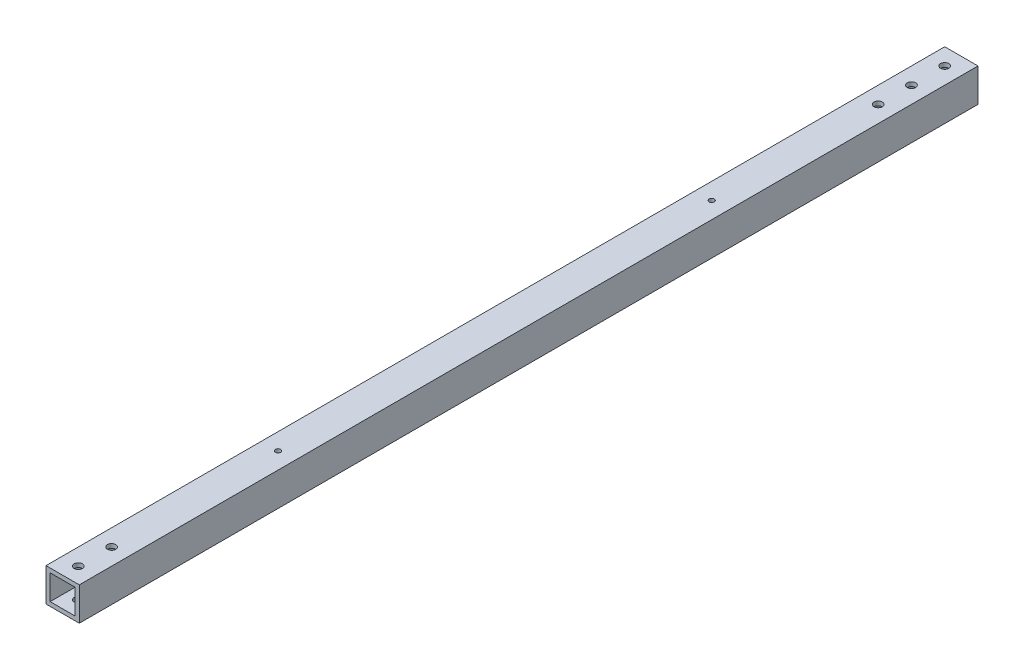
ISO-10303-21;
HEADER;
FILE_DESCRIPTION(('STEP AP214'),'2;1');
FILE_NAME('part.step','',(''),(''),'','','');
FILE_SCHEMA(('AUTOMOTIVE_DESIGN { 1 0 10303 214 1 1 1 1 }'));
ENDSEC;
DATA;
#1=APPLICATION_CONTEXT('core data for automotive mechanical design processes');
#2=APPLICATION_PROTOCOL_DEFINITION('international standard','automotive_design',2000,#1);
#3=PRODUCT_CONTEXT('',#1,'mechanical');
#4=PRODUCT('Part','Part','',(#3));
#5=PRODUCT_RELATED_PRODUCT_CATEGORY('part','',(#4));
#6=PRODUCT_DEFINITION_FORMATION('','',#4);
#7=PRODUCT_DEFINITION_CONTEXT('part definition',#1,'design');
#8=PRODUCT_DEFINITION('design','',#6,#7);
#9=PRODUCT_DEFINITION_SHAPE('','',#8);
#10=(LENGTH_UNIT() NAMED_UNIT(*) SI_UNIT(.MILLI.,.METRE.));
#11=(NAMED_UNIT(*) PLANE_ANGLE_UNIT() SI_UNIT($,.RADIAN.));
#12=(NAMED_UNIT(*) SI_UNIT($,.STERADIAN.) SOLID_ANGLE_UNIT());
#13=UNCERTAINTY_MEASURE_WITH_UNIT(LENGTH_MEASURE(1.E-05),#10,'distance_accuracy_value','');
#14=(GEOMETRIC_REPRESENTATION_CONTEXT(3) GLOBAL_UNCERTAINTY_ASSIGNED_CONTEXT((#13)) GLOBAL_UNIT_ASSIGNED_CONTEXT((#10,
#11,#12)) REPRESENTATION_CONTEXT('',''));
#15=CARTESIAN_POINT('',(0.,0.,0.));
#16=DIRECTION('',(0.,0.,1.));
#17=DIRECTION('',(1.,0.,0.));
#18=AXIS2_PLACEMENT_3D('',#15,#16,#17);
#19=CARTESIAN_POINT('',(12.7,12.7,342.9));
#20=DIRECTION('',(0.,-1.,0.));
#21=DIRECTION('',(1.,0.,0.));
#22=AXIS2_PLACEMENT_3D('',#19,#20,#21);
#23=PLANE('',#22);
#24=CARTESIAN_POINT('',(0.,12.7,305.511799987541));
#25=DIRECTION('',(0.,1.,0.));
#26=DIRECTION('',(0.,0.,1.));
#27=AXIS2_PLACEMENT_3D('',#24,#25,#26);
#28=CIRCLE('',#27,3.17499999999999);
#29=CARTESIAN_POINT('',(0.,12.7,308.686799987541));
#30=VERTEX_POINT('',#29);
#31=EDGE_CURVE('E196',#30,#30,#28,.T.);
#32=ORIENTED_EDGE('',*,*,#31,.F.);
#33=EDGE_LOOP('',(#32));
#34=FACE_BOUND('',#33,.T.);
#35=CARTESIAN_POINT('',(-3.7175124090183E-12,12.7,-330.199999999998));
#36=DIRECTION('',(0.,1.,0.));
#37=DIRECTION('',(0.,0.,1.));
#38=AXIS2_PLACEMENT_3D('',#35,#36,#37);
#39=CIRCLE('',#38,3.17499999999999);
#40=CARTESIAN_POINT('',(-3.7175124090183E-12,12.7,-327.024999999998));
#41=VERTEX_POINT('',#40);
#42=EDGE_CURVE('E193',#41,#41,#39,.T.);
#43=ORIENTED_EDGE('',*,*,#42,.F.);
#44=EDGE_LOOP('',(#43));
#45=FACE_BOUND('',#44,.T.);
#46=CARTESIAN_POINT('',(0.,12.7,-304.799999999998));
#47=DIRECTION('',(0.,1.,0.));
#48=DIRECTION('',(0.,0.,1.));
#49=AXIS2_PLACEMENT_3D('',#46,#47,#48);
#50=CIRCLE('',#49,3.17499999999999);
#51=CARTESIAN_POINT('',(0.,12.7,-301.624999999998));
#52=VERTEX_POINT('',#51);
#53=EDGE_CURVE('E211',#52,#52,#50,.T.);
#54=ORIENTED_EDGE('',*,*,#53,.F.);
#55=EDGE_LOOP('',(#54));
#56=FACE_BOUND('',#55,.T.);
#57=CARTESIAN_POINT('',(-2.38524477946811E-12,12.7,-279.399999999999));
#58=DIRECTION('',(0.,1.,0.));
#59=DIRECTION('',(0.,0.,1.));
#60=AXIS2_PLACEMENT_3D('',#57,#58,#59);
#61=CIRCLE('',#60,3.17499999999999);
#62=CARTESIAN_POINT('',(-2.38524477946811E-12,12.7,-276.224999999999));
#63=VERTEX_POINT('',#62);
#64=EDGE_CURVE('E218',#63,#63,#61,.T.);
#65=ORIENTED_EDGE('',*,*,#64,.F.);
#66=EDGE_LOOP('',(#65));
#67=FACE_BOUND('',#66,.T.);
#68=CARTESIAN_POINT('',(0.,12.7,-152.4));
#69=DIRECTION('',(0.,1.,0.));
#70=DIRECTION('',(0.,0.,1.));
#71=AXIS2_PLACEMENT_3D('',#68,#69,#70);
#72=CIRCLE('',#71,1.98437499999999);
#73=CARTESIAN_POINT('',(0.,12.7,-150.415625));
#74=VERTEX_POINT('',#73);
#75=EDGE_CURVE('E225',#74,#74,#72,.T.);
#76=ORIENTED_EDGE('',*,*,#75,.F.);
#77=EDGE_LOOP('',(#76));
#78=FACE_BOUND('',#77,.T.);
#79=CARTESIAN_POINT('',(0.,12.7,178.5118096));
#80=DIRECTION('',(0.,1.,0.));
#81=DIRECTION('',(0.,0.,1.));
#82=AXIS2_PLACEMENT_3D('',#79,#80,#81);
#83=CIRCLE('',#82,1.98437499999999);
#84=CARTESIAN_POINT('',(0.,12.7,180.4961846));
#85=VERTEX_POINT('',#84);
#86=EDGE_CURVE('E237',#85,#85,#83,.T.);
#87=ORIENTED_EDGE('',*,*,#86,.F.);
#88=EDGE_LOOP('',(#87));
#89=FACE_BOUND('',#88,.T.);
#90=DIRECTION('',(0.,0.,-1.));
#91=VECTOR('',#90,1.);
#92=CARTESIAN_POINT('',(12.7,12.7,342.9));
#93=LINE('',#92,#91);
#94=CARTESIAN_POINT('',(12.7,12.7,342.9));
#95=VERTEX_POINT('',#94);
#96=CARTESIAN_POINT('',(12.7,12.7,-342.9));
#97=VERTEX_POINT('',#96);
#98=EDGE_CURVE('E169',#95,#97,#93,.T.);
#99=ORIENTED_EDGE('',*,*,#98,.T.);
#100=DIRECTION('',(-1.,0.,0.));
#101=VECTOR('',#100,1.);
#102=CARTESIAN_POINT('',(12.7,12.7,-342.9));
#103=LINE('',#102,#101);
#104=CARTESIAN_POINT('',(-12.7,12.7,-342.9));
#105=VERTEX_POINT('',#104);
#106=EDGE_CURVE('E147',#97,#105,#103,.T.);
#107=ORIENTED_EDGE('',*,*,#106,.T.);
#108=DIRECTION('',(0.,0.,-1.));
#109=VECTOR('',#108,1.);
#110=CARTESIAN_POINT('',(-12.7,12.7,342.9));
#111=LINE('',#110,#109);
#112=CARTESIAN_POINT('',(-12.7,12.7,342.9));
#113=VERTEX_POINT('',#112);
#114=EDGE_CURVE('E167',#113,#105,#111,.T.);
#115=ORIENTED_EDGE('',*,*,#114,.F.);
#116=DIRECTION('',(-1.,0.,0.));
#117=VECTOR('',#116,1.);
#118=CARTESIAN_POINT('',(12.7,12.7,342.9));
#119=LINE('',#118,#117);
#120=EDGE_CURVE('E61',#95,#113,#119,.T.);
#121=ORIENTED_EDGE('',*,*,#120,.F.);
#122=EDGE_LOOP('',(#99,#107,#115,#121));
#123=FACE_BOUND('',#122,.T.);
#124=CARTESIAN_POINT('',(7.23379689482329E-13,12.7,330.911799987541));
#125=DIRECTION('',(0.,1.,0.));
#126=DIRECTION('',(0.,0.,1.));
#127=AXIS2_PLACEMENT_3D('',#124,#125,#126);
#128=CIRCLE('',#127,3.17499999999999);
#129=CARTESIAN_POINT('',(7.23379689482329E-13,12.7,334.086799987541));
#130=VERTEX_POINT('',#129);
#131=EDGE_CURVE('E316',#130,#130,#128,.T.);
#132=ORIENTED_EDGE('',*,*,#131,.F.);
#133=EDGE_LOOP('',(#132));
#134=FACE_BOUND('',#133,.T.);
#135=ADVANCED_FACE('F36',(#34,#45,#56,#67,#78,#89,#123,#134),#23,.F.);
#136=CARTESIAN_POINT('',(0.,0.,342.9));
#137=DIRECTION('',(0.,0.,1.));
#138=DIRECTION('',(1.,0.,0.));
#139=AXIS2_PLACEMENT_3D('',#136,#137,#138);
#140=PLANE('',#139);
#141=DIRECTION('',(0.,-1.,0.));
#142=VECTOR('',#141,1.);
#143=CARTESIAN_POINT('',(-12.7,12.7,342.9));
#144=LINE('',#143,#142);
#145=CARTESIAN_POINT('',(-12.7,-12.7,342.9));
#146=VERTEX_POINT('',#145);
#147=EDGE_CURVE('E114',#113,#146,#144,.T.);
#148=ORIENTED_EDGE('',*,*,#147,.T.);
#149=DIRECTION('',(1.,0.,0.));
#150=VECTOR('',#149,1.);
#151=CARTESIAN_POINT('',(-12.7,-12.7,342.9));
#152=LINE('',#151,#150);
#153=CARTESIAN_POINT('',(12.7,-12.7,342.9));
#154=VERTEX_POINT('',#153);
#155=EDGE_CURVE('E162',#146,#154,#152,.T.);
#156=ORIENTED_EDGE('',*,*,#155,.T.);
#157=DIRECTION('',(0.,1.,0.));
#158=VECTOR('',#157,1.);
#159=CARTESIAN_POINT('',(12.7,-12.7,342.9));
#160=LINE('',#159,#158);
#161=EDGE_CURVE('E164',#154,#95,#160,.T.);
#162=ORIENTED_EDGE('',*,*,#161,.T.);
#163=ORIENTED_EDGE('',*,*,#120,.T.);
#164=EDGE_LOOP('',(#148,#156,#162,#163));
#165=FACE_BOUND('',#164,.T.);
#166=DIRECTION('',(1.,0.,0.));
#167=VECTOR('',#166,1.);
#168=CARTESIAN_POINT('',(-9.525,-9.525,342.9));
#169=LINE('',#168,#167);
#170=CARTESIAN_POINT('',(-9.525,-9.525,342.9));
#171=VERTEX_POINT('',#170);
#172=CARTESIAN_POINT('',(9.52500000000001,-9.525,342.9));
#173=VERTEX_POINT('',#172);
#174=EDGE_CURVE('E151',#171,#173,#169,.T.);
#175=ORIENTED_EDGE('',*,*,#174,.F.);
#176=DIRECTION('',(0.,-1.,0.));
#177=VECTOR('',#176,1.);
#178=CARTESIAN_POINT('',(-9.52500000000001,9.525,342.9));
#179=LINE('',#178,#177);
#180=CARTESIAN_POINT('',(-9.52500000000001,9.525,342.9));
#181=VERTEX_POINT('',#180);
#182=EDGE_CURVE('E111',#181,#171,#179,.T.);
#183=ORIENTED_EDGE('',*,*,#182,.F.);
#184=DIRECTION('',(-1.,0.,0.));
#185=VECTOR('',#184,1.);
#186=CARTESIAN_POINT('',(9.525,9.525,342.9));
#187=LINE('',#186,#185);
#188=CARTESIAN_POINT('',(9.525,9.525,342.9));
#189=VERTEX_POINT('',#188);
#190=EDGE_CURVE('E155',#189,#181,#187,.T.);
#191=ORIENTED_EDGE('',*,*,#190,.F.);
#192=DIRECTION('',(0.,1.,0.));
#193=VECTOR('',#192,1.);
#194=CARTESIAN_POINT('',(9.52500000000001,-9.525,342.9));
#195=LINE('',#194,#193);
#196=EDGE_CURVE('E153',#173,#189,#195,.T.);
#197=ORIENTED_EDGE('',*,*,#196,.F.);
#198=EDGE_LOOP('',(#175,#183,#191,#197));
#199=FACE_BOUND('',#198,.T.);
#200=ADVANCED_FACE('F255',(#165,#199),#140,.T.);
#201=CARTESIAN_POINT('',(-12.7,12.7,342.9));
#202=DIRECTION('',(1.,0.,0.));
#203=DIRECTION('',(0.,0.,-1.));
#204=AXIS2_PLACEMENT_3D('',#201,#202,#203);
#205=PLANE('',#204);
#206=ORIENTED_EDGE('',*,*,#114,.T.);
#207=DIRECTION('',(0.,-1.,0.));
#208=VECTOR('',#207,1.);
#209=CARTESIAN_POINT('',(-12.7,12.7,-342.9));
#210=LINE('',#209,#208);
#211=CARTESIAN_POINT('',(-12.7,-12.7,-342.9));
#212=VERTEX_POINT('',#211);
#213=EDGE_CURVE('E138',#105,#212,#210,.T.);
#214=ORIENTED_EDGE('',*,*,#213,.T.);
#215=DIRECTION('',(0.,0.,-1.));
#216=VECTOR('',#215,1.);
#217=CARTESIAN_POINT('',(-12.7,-12.7,342.9));
#218=LINE('',#217,#216);
#219=EDGE_CURVE('E11',#146,#212,#218,.T.);
#220=ORIENTED_EDGE('',*,*,#219,.F.);
#221=ORIENTED_EDGE('',*,*,#147,.F.);
#222=EDGE_LOOP('',(#206,#214,#220,#221));
#223=FACE_BOUND('',#222,.T.);
#224=ADVANCED_FACE('F38',(#223),#205,.F.);
#225=CARTESIAN_POINT('',(-12.7,-12.7,342.9));
#226=DIRECTION('',(0.,1.,0.));
#227=DIRECTION('',(-1.,0.,0.));
#228=AXIS2_PLACEMENT_3D('',#225,#226,#227);
#229=PLANE('',#228);
#230=CARTESIAN_POINT('',(7.23379689482329E-13,-12.7,330.911799987541));
#231=DIRECTION('',(0.,1.,0.));
#232=DIRECTION('',(0.,0.,1.));
#233=AXIS2_PLACEMENT_3D('',#230,#231,#232);
#234=CIRCLE('',#233,3.17499999999998);
#235=CARTESIAN_POINT('',(7.23379689482329E-13,-12.7,334.086799987541));
#236=VERTEX_POINT('',#235);
#237=EDGE_CURVE('E291',#236,#236,#234,.T.);
#238=ORIENTED_EDGE('',*,*,#237,.T.);
#239=EDGE_LOOP('',(#238));
#240=FACE_BOUND('',#239,.T.);
#241=CARTESIAN_POINT('',(0.,-12.7,305.511799987541));
#242=DIRECTION('',(0.,1.,0.));
#243=DIRECTION('',(0.,0.,1.));
#244=AXIS2_PLACEMENT_3D('',#241,#242,#243);
#245=CIRCLE('',#244,3.17499999999998);
#246=CARTESIAN_POINT('',(0.,-12.7,308.686799987541));
#247=VERTEX_POINT('',#246);
#248=EDGE_CURVE('E189',#247,#247,#245,.T.);
#249=ORIENTED_EDGE('',*,*,#248,.T.);
#250=EDGE_LOOP('',(#249));
#251=FACE_BOUND('',#250,.T.);
#252=CARTESIAN_POINT('',(-3.7175124090183E-12,-12.7,-330.199999999998));
#253=DIRECTION('',(0.,1.,0.));
#254=DIRECTION('',(0.,0.,1.));
#255=AXIS2_PLACEMENT_3D('',#252,#253,#254);
#256=CIRCLE('',#255,3.17499999999998);
#257=CARTESIAN_POINT('',(-3.7175124090183E-12,-12.7,-327.024999999998));
#258=VERTEX_POINT('',#257);
#259=EDGE_CURVE('E185',#258,#258,#256,.T.);
#260=ORIENTED_EDGE('',*,*,#259,.T.);
#261=EDGE_LOOP('',(#260));
#262=FACE_BOUND('',#261,.T.);
#263=CARTESIAN_POINT('',(0.,-12.7,-304.799999999998));
#264=DIRECTION('',(0.,1.,0.));
#265=DIRECTION('',(0.,0.,1.));
#266=AXIS2_PLACEMENT_3D('',#263,#264,#265);
#267=CIRCLE('',#266,3.17499999999998);
#268=CARTESIAN_POINT('',(0.,-12.7,-301.624999999998));
#269=VERTEX_POINT('',#268);
#270=EDGE_CURVE('E181',#269,#269,#267,.T.);
#271=ORIENTED_EDGE('',*,*,#270,.T.);
#272=EDGE_LOOP('',(#271));
#273=FACE_BOUND('',#272,.T.);
#274=CARTESIAN_POINT('',(-2.38524477946811E-12,-12.7,-279.399999999999));
#275=DIRECTION('',(0.,1.,0.));
#276=DIRECTION('',(0.,0.,1.));
#277=AXIS2_PLACEMENT_3D('',#274,#275,#276);
#278=CIRCLE('',#277,3.17499999999998);
#279=CARTESIAN_POINT('',(-2.38524477946811E-12,-12.7,-276.224999999999));
#280=VERTEX_POINT('',#279);
#281=EDGE_CURVE('E176',#280,#280,#278,.T.);
#282=ORIENTED_EDGE('',*,*,#281,.T.);
#283=EDGE_LOOP('',(#282));
#284=FACE_BOUND('',#283,.T.);
#285=CARTESIAN_POINT('',(0.,-12.7,-152.4));
#286=DIRECTION('',(0.,1.,0.));
#287=DIRECTION('',(0.,0.,1.));
#288=AXIS2_PLACEMENT_3D('',#285,#286,#287);
#289=CIRCLE('',#288,1.98437499999998);
#290=CARTESIAN_POINT('',(0.,-12.7,-150.415625));
#291=VERTEX_POINT('',#290);
#292=EDGE_CURVE('E228',#291,#291,#289,.T.);
#293=ORIENTED_EDGE('',*,*,#292,.T.);
#294=EDGE_LOOP('',(#293));
#295=FACE_BOUND('',#294,.T.);
#296=CARTESIAN_POINT('',(0.,-12.7,178.5118096));
#297=DIRECTION('',(0.,1.,0.));
#298=DIRECTION('',(0.,0.,1.));
#299=AXIS2_PLACEMENT_3D('',#296,#297,#298);
#300=CIRCLE('',#299,1.98437499999998);
#301=CARTESIAN_POINT('',(0.,-12.7,180.4961846));
#302=VERTEX_POINT('',#301);
#303=EDGE_CURVE('E240',#302,#302,#300,.T.);
#304=ORIENTED_EDGE('',*,*,#303,.T.);
#305=EDGE_LOOP('',(#304));
#306=FACE_BOUND('',#305,.T.);
#307=ORIENTED_EDGE('',*,*,#219,.T.);
#308=DIRECTION('',(1.,0.,0.));
#309=VECTOR('',#308,1.);
#310=CARTESIAN_POINT('',(-12.7,-12.7,-342.9));
#311=LINE('',#310,#309);
#312=CARTESIAN_POINT('',(12.7,-12.7,-342.9));
#313=VERTEX_POINT('',#312);
#314=EDGE_CURVE('E141',#212,#313,#311,.T.);
#315=ORIENTED_EDGE('',*,*,#314,.T.);
#316=DIRECTION('',(0.,0.,-1.));
#317=VECTOR('',#316,1.);
#318=CARTESIAN_POINT('',(12.7,-12.7,342.9));
#319=LINE('',#318,#317);
#320=EDGE_CURVE('E45',#154,#313,#319,.T.);
#321=ORIENTED_EDGE('',*,*,#320,.F.);
#322=ORIENTED_EDGE('',*,*,#155,.F.);
#323=EDGE_LOOP('',(#307,#315,#321,#322));
#324=FACE_BOUND('',#323,.T.);
#325=ADVANCED_FACE('F282',(#240,#251,#262,#273,#284,#295,#306,#324),#229,.F.);
#326=CARTESIAN_POINT('',(12.7,-12.7,342.9));
#327=DIRECTION('',(-1.,0.,0.));
#328=DIRECTION('',(0.,0.,1.));
#329=AXIS2_PLACEMENT_3D('',#326,#327,#328);
#330=PLANE('',#329);
#331=ORIENTED_EDGE('',*,*,#320,.T.);
#332=DIRECTION('',(0.,1.,0.));
#333=VECTOR('',#332,1.);
#334=CARTESIAN_POINT('',(12.7,-12.7,-342.9));
#335=LINE('',#334,#333);
#336=EDGE_CURVE('E144',#313,#97,#335,.T.);
#337=ORIENTED_EDGE('',*,*,#336,.T.);
#338=ORIENTED_EDGE('',*,*,#98,.F.);
#339=ORIENTED_EDGE('',*,*,#161,.F.);
#340=EDGE_LOOP('',(#331,#337,#338,#339));
#341=FACE_BOUND('',#340,.T.);
#342=ADVANCED_FACE('F280',(#341),#330,.F.);
#343=CARTESIAN_POINT('',(-9.52500000000001,9.525,342.9));
#344=DIRECTION('',(1.,0.,0.));
#345=DIRECTION('',(0.,1.,0.));
#346=AXIS2_PLACEMENT_3D('',#343,#344,#345);
#347=PLANE('',#346);
#348=DIRECTION('',(0.,0.,-1.));
#349=VECTOR('',#348,1.);
#350=CARTESIAN_POINT('',(-9.525,-9.525,342.9));
#351=LINE('',#350,#349);
#352=CARTESIAN_POINT('',(-9.525,-9.525,-342.9));
#353=VERTEX_POINT('',#352);
#354=EDGE_CURVE('E103',#171,#353,#351,.T.);
#355=ORIENTED_EDGE('',*,*,#354,.T.);
#356=DIRECTION('',(0.,-1.,0.));
#357=VECTOR('',#356,1.);
#358=CARTESIAN_POINT('',(-9.52500000000001,9.525,-342.9));
#359=LINE('',#358,#357);
#360=CARTESIAN_POINT('',(-9.52500000000001,9.525,-342.9));
#361=VERTEX_POINT('',#360);
#362=EDGE_CURVE('E108',#361,#353,#359,.T.);
#363=ORIENTED_EDGE('',*,*,#362,.F.);
#364=DIRECTION('',(0.,0.,-1.));
#365=VECTOR('',#364,1.);
#366=CARTESIAN_POINT('',(-9.52500000000001,9.525,342.9));
#367=LINE('',#366,#365);
#368=EDGE_CURVE('E157',#181,#361,#367,.T.);
#369=ORIENTED_EDGE('',*,*,#368,.F.);
#370=ORIENTED_EDGE('',*,*,#182,.T.);
#371=EDGE_LOOP('',(#355,#363,#369,#370));
#372=FACE_BOUND('',#371,.T.);
#373=ADVANCED_FACE('F105',(#372),#347,.T.);
#374=CARTESIAN_POINT('',(-9.525,-9.525,342.9));
#375=DIRECTION('',(0.,1.,0.));
#376=DIRECTION('',(0.,0.,1.));
#377=AXIS2_PLACEMENT_3D('',#374,#375,#376);
#378=PLANE('',#377);
#379=CARTESIAN_POINT('',(7.23379689482329E-13,-9.525,330.911799987541));
#380=DIRECTION('',(0.,1.,0.));
#381=DIRECTION('',(0.,0.,1.));
#382=AXIS2_PLACEMENT_3D('',#379,#380,#381);
#383=CIRCLE('',#382,3.17499999999999);
#384=CARTESIAN_POINT('',(7.23379689482329E-13,-9.525,334.086799987541));
#385=VERTEX_POINT('',#384);
#386=EDGE_CURVE('E40',#385,#385,#383,.T.);
#387=ORIENTED_EDGE('',*,*,#386,.F.);
#388=EDGE_LOOP('',(#387));
#389=FACE_BOUND('',#388,.T.);
#390=CARTESIAN_POINT('',(0.,-9.525,305.511799987541));
#391=DIRECTION('',(0.,1.,0.));
#392=DIRECTION('',(0.,0.,1.));
#393=AXIS2_PLACEMENT_3D('',#390,#391,#392);
#394=CIRCLE('',#393,3.17499999999999);
#395=CARTESIAN_POINT('',(0.,-9.525,308.686799987541));
#396=VERTEX_POINT('',#395);
#397=EDGE_CURVE('E188',#396,#396,#394,.T.);
#398=ORIENTED_EDGE('',*,*,#397,.F.);
#399=EDGE_LOOP('',(#398));
#400=FACE_BOUND('',#399,.T.);
#401=CARTESIAN_POINT('',(-3.7175124090183E-12,-9.525,-330.199999999998));
#402=DIRECTION('',(0.,1.,0.));
#403=DIRECTION('',(0.,0.,1.));
#404=AXIS2_PLACEMENT_3D('',#401,#402,#403);
#405=CIRCLE('',#404,3.17499999999999);
#406=CARTESIAN_POINT('',(-3.7175124090183E-12,-9.525,-327.024999999998));
#407=VERTEX_POINT('',#406);
#408=EDGE_CURVE('E184',#407,#407,#405,.T.);
#409=ORIENTED_EDGE('',*,*,#408,.F.);
#410=EDGE_LOOP('',(#409));
#411=FACE_BOUND('',#410,.T.);
#412=CARTESIAN_POINT('',(0.,-9.525,-304.799999999998));
#413=DIRECTION('',(0.,1.,0.));
#414=DIRECTION('',(0.,0.,1.));
#415=AXIS2_PLACEMENT_3D('',#412,#413,#414);
#416=CIRCLE('',#415,3.17499999999999);
#417=CARTESIAN_POINT('',(0.,-9.525,-301.624999999998));
#418=VERTEX_POINT('',#417);
#419=EDGE_CURVE('E180',#418,#418,#416,.T.);
#420=ORIENTED_EDGE('',*,*,#419,.F.);
#421=EDGE_LOOP('',(#420));
#422=FACE_BOUND('',#421,.T.);
#423=CARTESIAN_POINT('',(-2.38524477946811E-12,-9.525,-279.399999999999));
#424=DIRECTION('',(0.,1.,0.));
#425=DIRECTION('',(0.,0.,1.));
#426=AXIS2_PLACEMENT_3D('',#423,#424,#425);
#427=CIRCLE('',#426,3.17499999999999);
#428=CARTESIAN_POINT('',(-2.38524477946811E-12,-9.525,-276.224999999999));
#429=VERTEX_POINT('',#428);
#430=EDGE_CURVE('E175',#429,#429,#427,.T.);
#431=ORIENTED_EDGE('',*,*,#430,.F.);
#432=EDGE_LOOP('',(#431));
#433=FACE_BOUND('',#432,.T.);
#434=CARTESIAN_POINT('',(0.,-9.525,-152.4));
#435=DIRECTION('',(0.,1.,0.));
#436=DIRECTION('',(0.,0.,1.));
#437=AXIS2_PLACEMENT_3D('',#434,#435,#436);
#438=CIRCLE('',#437,1.98437499999999);
#439=CARTESIAN_POINT('',(0.,-9.525,-150.415625));
#440=VERTEX_POINT('',#439);
#441=EDGE_CURVE('E234',#440,#440,#438,.T.);
#442=ORIENTED_EDGE('',*,*,#441,.F.);
#443=EDGE_LOOP('',(#442));
#444=FACE_BOUND('',#443,.T.);
#445=CARTESIAN_POINT('',(0.,-9.525,178.5118096));
#446=DIRECTION('',(0.,1.,0.));
#447=DIRECTION('',(0.,0.,1.));
#448=AXIS2_PLACEMENT_3D('',#445,#446,#447);
#449=CIRCLE('',#448,1.98437499999999);
#450=CARTESIAN_POINT('',(0.,-9.525,180.4961846));
#451=VERTEX_POINT('',#450);
#452=EDGE_CURVE('E129',#451,#451,#449,.T.);
#453=ORIENTED_EDGE('',*,*,#452,.F.);
#454=EDGE_LOOP('',(#453));
#455=FACE_BOUND('',#454,.T.);
#456=DIRECTION('',(0.,0.,-1.));
#457=VECTOR('',#456,1.);
#458=CARTESIAN_POINT('',(9.52500000000001,-9.525,342.9));
#459=LINE('',#458,#457);
#460=CARTESIAN_POINT('',(9.52500000000001,-9.525,-342.9));
#461=VERTEX_POINT('',#460);
#462=EDGE_CURVE('E115',#173,#461,#459,.T.);
#463=ORIENTED_EDGE('',*,*,#462,.T.);
#464=DIRECTION('',(1.,0.,0.));
#465=VECTOR('',#464,1.);
#466=CARTESIAN_POINT('',(-9.525,-9.525,-342.9));
#467=LINE('',#466,#465);
#468=EDGE_CURVE('E118',#353,#461,#467,.T.);
#469=ORIENTED_EDGE('',*,*,#468,.F.);
#470=ORIENTED_EDGE('',*,*,#354,.F.);
#471=ORIENTED_EDGE('',*,*,#174,.T.);
#472=EDGE_LOOP('',(#463,#469,#470,#471));
#473=FACE_BOUND('',#472,.T.);
#474=ADVANCED_FACE('F119',(#389,#400,#411,#422,#433,#444,#455,#473),#378,.T.);
#475=CARTESIAN_POINT('',(9.52500000000001,-9.525,342.9));
#476=DIRECTION('',(-1.,0.,0.));
#477=DIRECTION('',(0.,-1.,0.));
#478=AXIS2_PLACEMENT_3D('',#475,#476,#477);
#479=PLANE('',#478);
#480=DIRECTION('',(0.,0.,-1.));
#481=VECTOR('',#480,1.);
#482=CARTESIAN_POINT('',(9.525,9.525,342.9));
#483=LINE('',#482,#481);
#484=CARTESIAN_POINT('',(9.525,9.525,-342.9));
#485=VERTEX_POINT('',#484);
#486=EDGE_CURVE('E53',#189,#485,#483,.T.);
#487=ORIENTED_EDGE('',*,*,#486,.T.);
#488=DIRECTION('',(0.,1.,0.));
#489=VECTOR('',#488,1.);
#490=CARTESIAN_POINT('',(9.52500000000001,-9.525,-342.9));
#491=LINE('',#490,#489);
#492=EDGE_CURVE('E124',#461,#485,#491,.T.);
#493=ORIENTED_EDGE('',*,*,#492,.F.);
#494=ORIENTED_EDGE('',*,*,#462,.F.);
#495=ORIENTED_EDGE('',*,*,#196,.T.);
#496=EDGE_LOOP('',(#487,#493,#494,#495));
#497=FACE_BOUND('',#496,.T.);
#498=ADVANCED_FACE('F250',(#497),#479,.T.);
#499=CARTESIAN_POINT('',(9.525,9.525,342.9));
#500=DIRECTION('',(0.,-1.,0.));
#501=DIRECTION('',(0.,0.,-1.));
#502=AXIS2_PLACEMENT_3D('',#499,#500,#501);
#503=PLANE('',#502);
#504=CARTESIAN_POINT('',(7.23379689482329E-13,9.525,330.911799987541));
#505=DIRECTION('',(0.,-1.,0.));
#506=DIRECTION('',(0.,0.,-1.));
#507=AXIS2_PLACEMENT_3D('',#504,#505,#506);
#508=CIRCLE('',#507,3.17499999999999);
#509=CARTESIAN_POINT('',(7.23379689482329E-13,9.525,327.736799987541));
#510=VERTEX_POINT('',#509);
#511=EDGE_CURVE('E201',#510,#510,#508,.T.);
#512=ORIENTED_EDGE('',*,*,#511,.F.);
#513=EDGE_LOOP('',(#512));
#514=FACE_BOUND('',#513,.T.);
#515=CARTESIAN_POINT('',(0.,9.525,305.511799987541));
#516=DIRECTION('',(0.,-1.,0.));
#517=DIRECTION('',(0.,0.,-1.));
#518=AXIS2_PLACEMENT_3D('',#515,#516,#517);
#519=CIRCLE('',#518,3.17499999999999);
#520=CARTESIAN_POINT('',(0.,9.525,302.336799987541));
#521=VERTEX_POINT('',#520);
#522=EDGE_CURVE('E186',#521,#521,#519,.T.);
#523=ORIENTED_EDGE('',*,*,#522,.F.);
#524=EDGE_LOOP('',(#523));
#525=FACE_BOUND('',#524,.T.);
#526=CARTESIAN_POINT('',(-3.7175124090183E-12,9.525,-330.199999999998));
#527=DIRECTION('',(0.,-1.,0.));
#528=DIRECTION('',(0.,0.,-1.));
#529=AXIS2_PLACEMENT_3D('',#526,#527,#528);
#530=CIRCLE('',#529,3.17499999999999);
#531=CARTESIAN_POINT('',(-3.7175124090183E-12,9.525,-333.374999999998));
#532=VERTEX_POINT('',#531);
#533=EDGE_CURVE('E182',#532,#532,#530,.T.);
#534=ORIENTED_EDGE('',*,*,#533,.F.);
#535=EDGE_LOOP('',(#534));
#536=FACE_BOUND('',#535,.T.);
#537=CARTESIAN_POINT('',(0.,9.525,-304.799999999998));
#538=DIRECTION('',(0.,-1.,0.));
#539=DIRECTION('',(0.,0.,-1.));
#540=AXIS2_PLACEMENT_3D('',#537,#538,#539);
#541=CIRCLE('',#540,3.17499999999999);
#542=CARTESIAN_POINT('',(0.,9.525,-307.974999999998));
#543=VERTEX_POINT('',#542);
#544=EDGE_CURVE('E177',#543,#543,#541,.T.);
#545=ORIENTED_EDGE('',*,*,#544,.F.);
#546=EDGE_LOOP('',(#545));
#547=FACE_BOUND('',#546,.T.);
#548=CARTESIAN_POINT('',(-2.38524477946811E-12,9.525,-279.399999999999));
#549=DIRECTION('',(0.,-1.,0.));
#550=DIRECTION('',(0.,0.,-1.));
#551=AXIS2_PLACEMENT_3D('',#548,#549,#550);
#552=CIRCLE('',#551,3.17499999999999);
#553=CARTESIAN_POINT('',(-2.38524477946811E-12,9.525,-282.574999999999));
#554=VERTEX_POINT('',#553);
#555=EDGE_CURVE('E172',#554,#554,#552,.T.);
#556=ORIENTED_EDGE('',*,*,#555,.F.);
#557=EDGE_LOOP('',(#556));
#558=FACE_BOUND('',#557,.T.);
#559=CARTESIAN_POINT('',(0.,9.525,-152.4));
#560=DIRECTION('',(0.,-1.,0.));
#561=DIRECTION('',(0.,0.,-1.));
#562=AXIS2_PLACEMENT_3D('',#559,#560,#561);
#563=CIRCLE('',#562,1.98437499999999);
#564=CARTESIAN_POINT('',(0.,9.525,-154.384375));
#565=VERTEX_POINT('',#564);
#566=EDGE_CURVE('E231',#565,#565,#563,.T.);
#567=ORIENTED_EDGE('',*,*,#566,.F.);
#568=EDGE_LOOP('',(#567));
#569=FACE_BOUND('',#568,.T.);
#570=CARTESIAN_POINT('',(0.,9.525,178.5118096));
#571=DIRECTION('',(0.,-1.,0.));
#572=DIRECTION('',(0.,0.,-1.));
#573=AXIS2_PLACEMENT_3D('',#570,#571,#572);
#574=CIRCLE('',#573,1.98437499999999);
#575=CARTESIAN_POINT('',(0.,9.525,176.5274346));
#576=VERTEX_POINT('',#575);
#577=EDGE_CURVE('E132',#576,#576,#574,.T.);
#578=ORIENTED_EDGE('',*,*,#577,.F.);
#579=EDGE_LOOP('',(#578));
#580=FACE_BOUND('',#579,.T.);
#581=ORIENTED_EDGE('',*,*,#368,.T.);
#582=DIRECTION('',(-1.,0.,0.));
#583=VECTOR('',#582,1.);
#584=CARTESIAN_POINT('',(9.525,9.525,-342.9));
#585=LINE('',#584,#583);
#586=EDGE_CURVE('E128',#485,#361,#585,.T.);
#587=ORIENTED_EDGE('',*,*,#586,.F.);
#588=ORIENTED_EDGE('',*,*,#486,.F.);
#589=ORIENTED_EDGE('',*,*,#190,.T.);
#590=EDGE_LOOP('',(#581,#587,#588,#589));
#591=FACE_BOUND('',#590,.T.);
#592=ADVANCED_FACE('F248',(#514,#525,#536,#547,#558,#569,#580,#591),#503,.T.);
#593=CARTESIAN_POINT('',(0.,0.,-342.9));
#594=DIRECTION('',(0.,0.,1.));
#595=DIRECTION('',(1.,0.,0.));
#596=AXIS2_PLACEMENT_3D('',#593,#594,#595);
#597=PLANE('',#596);
#598=ORIENTED_EDGE('',*,*,#586,.T.);
#599=ORIENTED_EDGE('',*,*,#362,.T.);
#600=ORIENTED_EDGE('',*,*,#468,.T.);
#601=ORIENTED_EDGE('',*,*,#492,.T.);
#602=EDGE_LOOP('',(#598,#599,#600,#601));
#603=FACE_BOUND('',#602,.T.);
#604=ORIENTED_EDGE('',*,*,#213,.F.);
#605=ORIENTED_EDGE('',*,*,#106,.F.);
#606=ORIENTED_EDGE('',*,*,#336,.F.);
#607=ORIENTED_EDGE('',*,*,#314,.F.);
#608=EDGE_LOOP('',(#604,#605,#606,#607));
#609=FACE_BOUND('',#608,.T.);
#610=ADVANCED_FACE('F126',(#603,#609),#597,.F.);
#611=CARTESIAN_POINT('',(0.,12.7,178.5118096));
#612=DIRECTION('',(0.,1.,0.));
#613=DIRECTION('',(0.,0.,1.));
#614=AXIS2_PLACEMENT_3D('',#611,#612,#613);
#615=CYLINDRICAL_SURFACE('',#614,1.98437499999999);
#616=ORIENTED_EDGE('',*,*,#577,.T.);
#617=EDGE_LOOP('',(#616));
#618=FACE_BOUND('',#617,.T.);
#619=ORIENTED_EDGE('',*,*,#86,.T.);
#620=EDGE_LOOP('',(#619));
#621=FACE_BOUND('',#620,.T.);
#622=ADVANCED_FACE('F245',(#618,#621),#615,.F.);
#623=ORIENTED_EDGE('',*,*,#452,.T.);
#624=EDGE_LOOP('',(#623));
#625=FACE_BOUND('',#624,.T.);
#626=ORIENTED_EDGE('',*,*,#303,.F.);
#627=EDGE_LOOP('',(#626));
#628=FACE_BOUND('',#627,.T.);
#629=ADVANCED_FACE('F341',(#625,#628),#615,.F.);
#630=CARTESIAN_POINT('',(0.,12.7,-152.4));
#631=DIRECTION('',(0.,1.,0.));
#632=DIRECTION('',(0.,0.,1.));
#633=AXIS2_PLACEMENT_3D('',#630,#631,#632);
#634=CYLINDRICAL_SURFACE('',#633,1.98437499999999);
#635=ORIENTED_EDGE('',*,*,#566,.T.);
#636=EDGE_LOOP('',(#635));
#637=FACE_BOUND('',#636,.T.);
#638=ORIENTED_EDGE('',*,*,#75,.T.);
#639=EDGE_LOOP('',(#638));
#640=FACE_BOUND('',#639,.T.);
#641=ADVANCED_FACE('F344',(#637,#640),#634,.F.);
#642=ORIENTED_EDGE('',*,*,#441,.T.);
#643=EDGE_LOOP('',(#642));
#644=FACE_BOUND('',#643,.T.);
#645=ORIENTED_EDGE('',*,*,#292,.F.);
#646=EDGE_LOOP('',(#645));
#647=FACE_BOUND('',#646,.T.);
#648=ADVANCED_FACE('F350',(#644,#647),#634,.F.);
#649=CARTESIAN_POINT('',(-2.38524477946811E-12,12.7,-279.399999999999));
#650=DIRECTION('',(0.,1.,0.));
#651=DIRECTION('',(0.,0.,1.));
#652=AXIS2_PLACEMENT_3D('',#649,#650,#651);
#653=CYLINDRICAL_SURFACE('',#652,3.17499999999999);
#654=ORIENTED_EDGE('',*,*,#555,.T.);
#655=EDGE_LOOP('',(#654));
#656=FACE_BOUND('',#655,.T.);
#657=ORIENTED_EDGE('',*,*,#64,.T.);
#658=EDGE_LOOP('',(#657));
#659=FACE_BOUND('',#658,.T.);
#660=ADVANCED_FACE('F386',(#656,#659),#653,.F.);
#661=ORIENTED_EDGE('',*,*,#430,.T.);
#662=EDGE_LOOP('',(#661));
#663=FACE_BOUND('',#662,.T.);
#664=ORIENTED_EDGE('',*,*,#281,.F.);
#665=EDGE_LOOP('',(#664));
#666=FACE_BOUND('',#665,.T.);
#667=ADVANCED_FACE('F397',(#663,#666),#653,.F.);
#668=CARTESIAN_POINT('',(0.,12.7,-304.799999999998));
#669=DIRECTION('',(0.,1.,0.));
#670=DIRECTION('',(0.,0.,1.));
#671=AXIS2_PLACEMENT_3D('',#668,#669,#670);
#672=CYLINDRICAL_SURFACE('',#671,3.17499999999999);
#673=ORIENTED_EDGE('',*,*,#544,.T.);
#674=EDGE_LOOP('',(#673));
#675=FACE_BOUND('',#674,.T.);
#676=ORIENTED_EDGE('',*,*,#53,.T.);
#677=EDGE_LOOP('',(#676));
#678=FACE_BOUND('',#677,.T.);
#679=ADVANCED_FACE('F407',(#675,#678),#672,.F.);
#680=ORIENTED_EDGE('',*,*,#419,.T.);
#681=EDGE_LOOP('',(#680));
#682=FACE_BOUND('',#681,.T.);
#683=ORIENTED_EDGE('',*,*,#270,.F.);
#684=EDGE_LOOP('',(#683));
#685=FACE_BOUND('',#684,.T.);
#686=ADVANCED_FACE('F417',(#682,#685),#672,.F.);
#687=CARTESIAN_POINT('',(-3.7175124090183E-12,12.7,-330.199999999998));
#688=DIRECTION('',(0.,1.,0.));
#689=DIRECTION('',(0.,0.,1.));
#690=AXIS2_PLACEMENT_3D('',#687,#688,#689);
#691=CYLINDRICAL_SURFACE('',#690,3.17499999999999);
#692=ORIENTED_EDGE('',*,*,#533,.T.);
#693=EDGE_LOOP('',(#692));
#694=FACE_BOUND('',#693,.T.);
#695=ORIENTED_EDGE('',*,*,#42,.T.);
#696=EDGE_LOOP('',(#695));
#697=FACE_BOUND('',#696,.T.);
#698=ADVANCED_FACE('F428',(#694,#697),#691,.F.);
#699=ORIENTED_EDGE('',*,*,#408,.T.);
#700=EDGE_LOOP('',(#699));
#701=FACE_BOUND('',#700,.T.);
#702=ORIENTED_EDGE('',*,*,#259,.F.);
#703=EDGE_LOOP('',(#702));
#704=FACE_BOUND('',#703,.T.);
#705=ADVANCED_FACE('F437',(#701,#704),#691,.F.);
#706=CARTESIAN_POINT('',(0.,12.7,305.511799987541));
#707=DIRECTION('',(0.,1.,0.));
#708=DIRECTION('',(0.,0.,1.));
#709=AXIS2_PLACEMENT_3D('',#706,#707,#708);
#710=CYLINDRICAL_SURFACE('',#709,3.17499999999999);
#711=ORIENTED_EDGE('',*,*,#522,.T.);
#712=EDGE_LOOP('',(#711));
#713=FACE_BOUND('',#712,.T.);
#714=ORIENTED_EDGE('',*,*,#31,.T.);
#715=EDGE_LOOP('',(#714));
#716=FACE_BOUND('',#715,.T.);
#717=ADVANCED_FACE('F447',(#713,#716),#710,.F.);
#718=ORIENTED_EDGE('',*,*,#397,.T.);
#719=EDGE_LOOP('',(#718));
#720=FACE_BOUND('',#719,.T.);
#721=ORIENTED_EDGE('',*,*,#248,.F.);
#722=EDGE_LOOP('',(#721));
#723=FACE_BOUND('',#722,.T.);
#724=ADVANCED_FACE('F458',(#720,#723),#710,.F.);
#725=CARTESIAN_POINT('',(7.23379689482329E-13,12.7,330.911799987541));
#726=DIRECTION('',(0.,1.,0.));
#727=DIRECTION('',(0.,0.,1.));
#728=AXIS2_PLACEMENT_3D('',#725,#726,#727);
#729=CYLINDRICAL_SURFACE('',#728,3.17499999999999);
#730=ORIENTED_EDGE('',*,*,#386,.T.);
#731=EDGE_LOOP('',(#730));
#732=FACE_BOUND('',#731,.T.);
#733=ORIENTED_EDGE('',*,*,#237,.F.);
#734=EDGE_LOOP('',(#733));
#735=FACE_BOUND('',#734,.T.);
#736=ADVANCED_FACE('F326',(#732,#735),#729,.F.);
#737=ORIENTED_EDGE('',*,*,#511,.T.);
#738=EDGE_LOOP('',(#737));
#739=FACE_BOUND('',#738,.T.);
#740=ORIENTED_EDGE('',*,*,#131,.T.);
#741=EDGE_LOOP('',(#740));
#742=FACE_BOUND('',#741,.T.);
#743=ADVANCED_FACE('F471',(#739,#742),#729,.F.);
#744=CLOSED_SHELL('',(#135,#200,#224,#325,#342,#373,#474,#498,#592,#610,#622,#629,#641,#648,
#660,#667,#679,#686,#698,#705,#717,#724,#736,#743));
#745=MANIFOLD_SOLID_BREP('B2',#744);
#746=ADVANCED_BREP_SHAPE_REPRESENTATION('',(#18,#745),#14);
#747=SHAPE_DEFINITION_REPRESENTATION(#9,#746);
ENDSEC;
END-ISO-10303-21;
